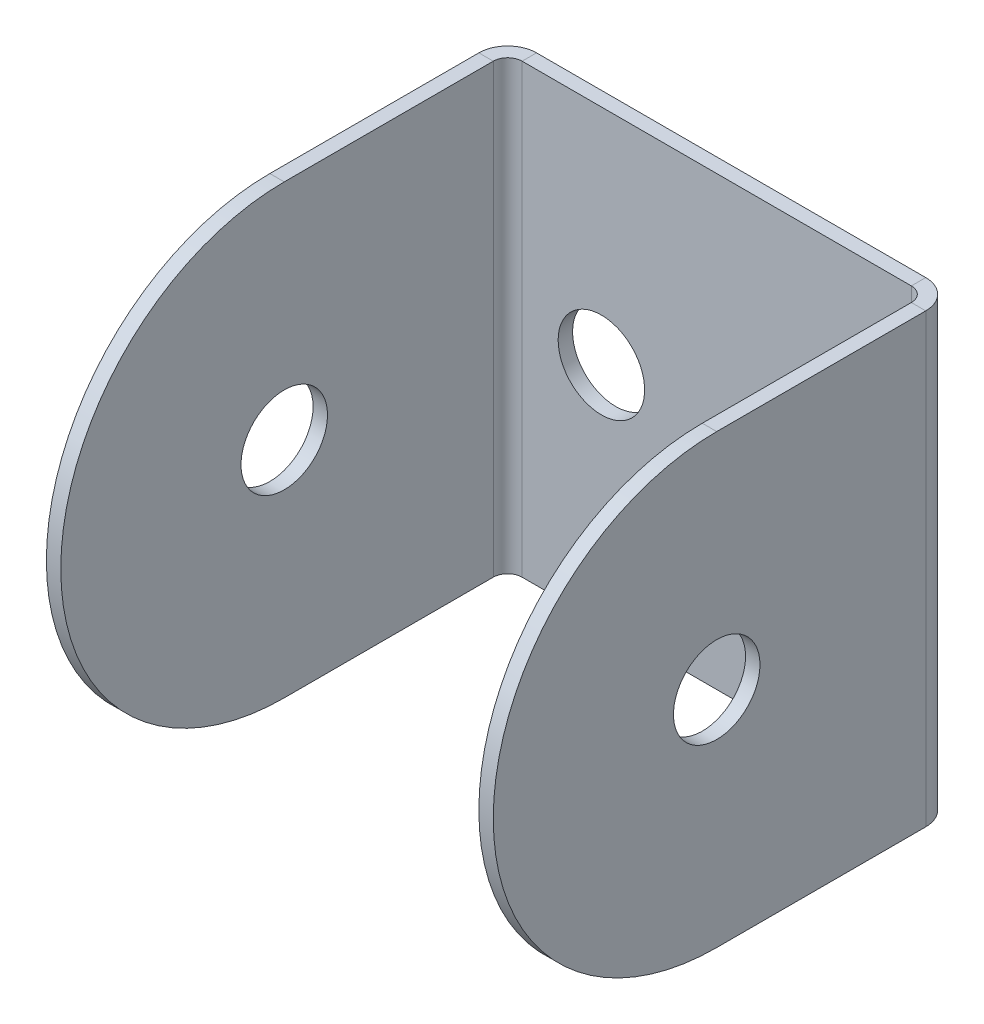
ISO-10303-21;
HEADER;
FILE_DESCRIPTION(('STEP AP214'),'2;1');
FILE_NAME('part.step','',(''),(''),'','','');
FILE_SCHEMA(('AUTOMOTIVE_DESIGN { 1 0 10303 214 1 1 1 1 }'));
ENDSEC;
DATA;
#1=APPLICATION_CONTEXT('core data for automotive mechanical design processes');
#2=APPLICATION_PROTOCOL_DEFINITION('international standard','automotive_design',2000,#1);
#3=PRODUCT_CONTEXT('',#1,'mechanical');
#4=PRODUCT('Part','Part','',(#3));
#5=PRODUCT_RELATED_PRODUCT_CATEGORY('part','',(#4));
#6=PRODUCT_DEFINITION_FORMATION('','',#4);
#7=PRODUCT_DEFINITION_CONTEXT('part definition',#1,'design');
#8=PRODUCT_DEFINITION('design','',#6,#7);
#9=PRODUCT_DEFINITION_SHAPE('','',#8);
#10=(LENGTH_UNIT() NAMED_UNIT(*) SI_UNIT(.MILLI.,.METRE.));
#11=(NAMED_UNIT(*) PLANE_ANGLE_UNIT() SI_UNIT($,.RADIAN.));
#12=(NAMED_UNIT(*) SI_UNIT($,.STERADIAN.) SOLID_ANGLE_UNIT());
#13=UNCERTAINTY_MEASURE_WITH_UNIT(LENGTH_MEASURE(1.E-05),#10,'distance_accuracy_value','');
#14=(GEOMETRIC_REPRESENTATION_CONTEXT(3) GLOBAL_UNCERTAINTY_ASSIGNED_CONTEXT((#13)) GLOBAL_UNIT_ASSIGNED_CONTEXT((#10,
#11,#12)) REPRESENTATION_CONTEXT('',''));
#15=CARTESIAN_POINT('',(0.,0.,0.));
#16=DIRECTION('',(0.,0.,1.));
#17=DIRECTION('',(1.,0.,0.));
#18=AXIS2_PLACEMENT_3D('',#15,#16,#17);
#19=CARTESIAN_POINT('',(-23.5068697123519,15.5,-18.6640439932318));
#20=DIRECTION('',(1.,0.,0.));
#21=DIRECTION('',(0.,0.,-1.));
#22=AXIS2_PLACEMENT_3D('',#19,#20,#21);
#23=PLANE('',#22);
#24=CARTESIAN_POINT('',(-23.5068697123519,7.75,-10.4140439932318));
#25=DIRECTION('',(1.,0.,0.));
#26=DIRECTION('',(0.,0.,-1.));
#27=AXIS2_PLACEMENT_3D('',#24,#25,#26);
#28=CIRCLE('',#27,1.5);
#29=CARTESIAN_POINT('',(-23.5068697123519,7.75,-11.9140439932318));
#30=VERTEX_POINT('',#29);
#31=EDGE_CURVE('E294',#30,#30,#28,.T.);
#32=ORIENTED_EDGE('',*,*,#31,.T.);
#33=EDGE_LOOP('',(#32));
#34=FACE_BOUND('',#33,.T.);
#35=DIRECTION('',(0.,0.,-1.));
#36=VECTOR('',#35,1.);
#37=CARTESIAN_POINT('',(-23.5068697123519,0.,-18.6640439932318));
#38=LINE('',#37,#36);
#39=CARTESIAN_POINT('',(-23.5068697123519,0.,-17.6640439932318));
#40=VERTEX_POINT('',#39);
#41=CARTESIAN_POINT('',(-23.5068697123519,0.,-10.4140439932318));
#42=VERTEX_POINT('',#41);
#43=EDGE_CURVE('E212',#40,#42,#38,.F.);
#44=ORIENTED_EDGE('',*,*,#43,.T.);
#45=CARTESIAN_POINT('',(-23.5068697123519,7.75,-10.4140439932318));
#46=DIRECTION('',(1.,0.,0.));
#47=DIRECTION('',(0.,0.,-1.));
#48=AXIS2_PLACEMENT_3D('',#45,#46,#47);
#49=CIRCLE('',#48,7.75);
#50=CARTESIAN_POINT('',(-23.5068697123519,15.5,-10.4140439932318));
#51=VERTEX_POINT('',#50);
#52=EDGE_CURVE('E291',#51,#42,#49,.T.);
#53=ORIENTED_EDGE('',*,*,#52,.F.);
#54=DIRECTION('',(0.,0.,-1.));
#55=VECTOR('',#54,1.);
#56=CARTESIAN_POINT('',(-23.5068697123519,15.5,-18.6640439932318));
#57=LINE('',#56,#55);
#58=CARTESIAN_POINT('',(-23.5068697123519,15.5,-17.6640439932318));
#59=VERTEX_POINT('',#58);
#60=EDGE_CURVE('E236',#59,#51,#57,.F.);
#61=ORIENTED_EDGE('',*,*,#60,.F.);
#62=DIRECTION('',(0.,-1.,0.));
#63=VECTOR('',#62,1.);
#64=CARTESIAN_POINT('',(-23.5068697123519,15.5,-17.6640439932318));
#65=LINE('',#64,#63);
#66=EDGE_CURVE('E208',#59,#40,#65,.T.);
#67=ORIENTED_EDGE('',*,*,#66,.T.);
#68=EDGE_LOOP('',(#44,#53,#61,#67));
#69=FACE_BOUND('',#68,.T.);
#70=ADVANCED_FACE('F88',(#34,#69),#23,.F.);
#71=CARTESIAN_POINT('',(-23.0068697123519,15.5,-18.6640439932318));
#72=DIRECTION('',(1.,0.,0.));
#73=DIRECTION('',(0.,0.,-1.));
#74=AXIS2_PLACEMENT_3D('',#71,#72,#73);
#75=PLANE('',#74);
#76=CARTESIAN_POINT('',(-23.0068697123519,7.75,-10.4140439932318));
#77=DIRECTION('',(1.,0.,0.));
#78=DIRECTION('',(0.,0.,-1.));
#79=AXIS2_PLACEMENT_3D('',#76,#77,#78);
#80=CIRCLE('',#79,1.5);
#81=CARTESIAN_POINT('',(-23.0068697123519,7.75,-11.9140439932318));
#82=VERTEX_POINT('',#81);
#83=EDGE_CURVE('E297',#82,#82,#80,.T.);
#84=ORIENTED_EDGE('',*,*,#83,.F.);
#85=EDGE_LOOP('',(#84));
#86=FACE_BOUND('',#85,.T.);
#87=CARTESIAN_POINT('',(-23.0068697123519,7.75,-10.4140439932318));
#88=DIRECTION('',(1.,0.,0.));
#89=DIRECTION('',(0.,0.,-1.));
#90=AXIS2_PLACEMENT_3D('',#87,#88,#89);
#91=CIRCLE('',#90,7.75);
#92=CARTESIAN_POINT('',(-23.0068697123519,15.5,-10.4140439932318));
#93=VERTEX_POINT('',#92);
#94=CARTESIAN_POINT('',(-23.0068697123519,0.,-10.4140439932318));
#95=VERTEX_POINT('',#94);
#96=EDGE_CURVE('E290',#93,#95,#91,.T.);
#97=ORIENTED_EDGE('',*,*,#96,.T.);
#98=DIRECTION('',(0.,0.,1.));
#99=VECTOR('',#98,1.);
#100=CARTESIAN_POINT('',(-23.0068697123519,0.,-18.6640439932318));
#101=LINE('',#100,#99);
#102=CARTESIAN_POINT('',(-23.0068697123519,0.,-17.6640439932318));
#103=VERTEX_POINT('',#102);
#104=EDGE_CURVE('E215',#103,#95,#101,.T.);
#105=ORIENTED_EDGE('',*,*,#104,.F.);
#106=DIRECTION('',(0.,-1.,0.));
#107=VECTOR('',#106,1.);
#108=CARTESIAN_POINT('',(-23.0068697123519,15.5,-17.6640439932318));
#109=LINE('',#108,#107);
#110=CARTESIAN_POINT('',(-23.0068697123519,15.5,-17.6640439932318));
#111=VERTEX_POINT('',#110);
#112=EDGE_CURVE('E250',#111,#103,#109,.T.);
#113=ORIENTED_EDGE('',*,*,#112,.F.);
#114=DIRECTION('',(0.,0.,1.));
#115=VECTOR('',#114,1.);
#116=CARTESIAN_POINT('',(-23.0068697123519,15.5,-18.6640439932318));
#117=LINE('',#116,#115);
#118=EDGE_CURVE('E284',#111,#93,#117,.T.);
#119=ORIENTED_EDGE('',*,*,#118,.T.);
#120=EDGE_LOOP('',(#97,#105,#113,#119));
#121=FACE_BOUND('',#120,.T.);
#122=ADVANCED_FACE('F361',(#86,#121),#75,.T.);
#123=CARTESIAN_POINT('',(-24.0068697123519,0.,-17.6640439932318));
#124=DIRECTION('',(0.,1.,0.));
#125=DIRECTION('',(1.,0.,0.));
#126=AXIS2_PLACEMENT_3D('',#123,#124,#125);
#127=PLANE('',#126);
#128=DIRECTION('',(-1.,0.,0.));
#129=VECTOR('',#128,1.);
#130=CARTESIAN_POINT('',(-23.5068697123519,0.,-10.4140439932318));
#131=LINE('',#130,#129);
#132=EDGE_CURVE('E317',#42,#95,#131,.F.);
#133=ORIENTED_EDGE('',*,*,#132,.F.);
#134=ORIENTED_EDGE('',*,*,#43,.F.);
#135=DIRECTION('',(1.,0.,0.));
#136=VECTOR('',#135,1.);
#137=CARTESIAN_POINT('',(-23.5068697123519,0.,-17.6640439932318));
#138=LINE('',#137,#136);
#139=EDGE_CURVE('E146',#40,#103,#138,.T.);
#140=ORIENTED_EDGE('',*,*,#139,.T.);
#141=ORIENTED_EDGE('',*,*,#104,.T.);
#142=EDGE_LOOP('',(#133,#134,#140,#141));
#143=FACE_BOUND('',#142,.T.);
#144=ADVANCED_FACE('F367',(#143),#127,.F.);
#145=CARTESIAN_POINT('',(-38.5068697123519,15.5,-18.6640439932318));
#146=DIRECTION('',(-1.,0.,0.));
#147=DIRECTION('',(0.,0.,1.));
#148=AXIS2_PLACEMENT_3D('',#145,#146,#147);
#149=PLANE('',#148);
#150=CARTESIAN_POINT('',(-38.5068697123519,7.75,-10.4140439932318));
#151=DIRECTION('',(1.,0.,0.));
#152=DIRECTION('',(0.,0.,-1.));
#153=AXIS2_PLACEMENT_3D('',#150,#151,#152);
#154=CIRCLE('',#153,1.5);
#155=CARTESIAN_POINT('',(-38.5068697123519,7.75,-11.9140439932318));
#156=VERTEX_POINT('',#155);
#157=EDGE_CURVE('E309',#156,#156,#154,.T.);
#158=ORIENTED_EDGE('',*,*,#157,.T.);
#159=EDGE_LOOP('',(#158));
#160=FACE_BOUND('',#159,.T.);
#161=CARTESIAN_POINT('',(-38.5068697123519,7.75,-10.4140439932318));
#162=DIRECTION('',(-1.,0.,0.));
#163=DIRECTION('',(0.,0.,1.));
#164=AXIS2_PLACEMENT_3D('',#161,#162,#163);
#165=CIRCLE('',#164,7.75);
#166=CARTESIAN_POINT('',(-38.5068697123519,0.,-10.4140439932318));
#167=VERTEX_POINT('',#166);
#168=CARTESIAN_POINT('',(-38.5068697123519,15.5,-10.4140439932318));
#169=VERTEX_POINT('',#168);
#170=EDGE_CURVE('E303',#167,#169,#165,.T.);
#171=ORIENTED_EDGE('',*,*,#170,.T.);
#172=DIRECTION('',(0.,0.,-1.));
#173=VECTOR('',#172,1.);
#174=CARTESIAN_POINT('',(-38.5068697123519,15.5,-18.6640439932318));
#175=LINE('',#174,#173);
#176=CARTESIAN_POINT('',(-38.5068697123519,15.5,-17.6640439932318));
#177=VERTEX_POINT('',#176);
#178=EDGE_CURVE('E269',#169,#177,#175,.T.);
#179=ORIENTED_EDGE('',*,*,#178,.T.);
#180=DIRECTION('',(0.,-1.,0.));
#181=VECTOR('',#180,1.);
#182=CARTESIAN_POINT('',(-38.5068697123519,15.5,-17.6640439932318));
#183=LINE('',#182,#181);
#184=CARTESIAN_POINT('',(-38.5068697123519,0.,-17.6640439932318));
#185=VERTEX_POINT('',#184);
#186=EDGE_CURVE('E241',#177,#185,#183,.T.);
#187=ORIENTED_EDGE('',*,*,#186,.T.);
#188=DIRECTION('',(0.,0.,-1.));
#189=VECTOR('',#188,1.);
#190=CARTESIAN_POINT('',(-38.5068697123519,0.,-18.6640439932318));
#191=LINE('',#190,#189);
#192=EDGE_CURVE('E227',#167,#185,#191,.T.);
#193=ORIENTED_EDGE('',*,*,#192,.F.);
#194=EDGE_LOOP('',(#171,#179,#187,#193));
#195=FACE_BOUND('',#194,.T.);
#196=ADVANCED_FACE('F416',(#160,#195),#149,.T.);
#197=CARTESIAN_POINT('',(-38.0068697123519,15.5,-18.6640439932318));
#198=DIRECTION('',(-1.,0.,0.));
#199=DIRECTION('',(0.,0.,1.));
#200=AXIS2_PLACEMENT_3D('',#197,#198,#199);
#201=PLANE('',#200);
#202=CARTESIAN_POINT('',(-38.0068697123519,7.75,-10.4140439932318));
#203=DIRECTION('',(1.,0.,0.));
#204=DIRECTION('',(0.,0.,-1.));
#205=AXIS2_PLACEMENT_3D('',#202,#203,#204);
#206=CIRCLE('',#205,1.5);
#207=CARTESIAN_POINT('',(-38.0068697123519,7.75,-11.9140439932318));
#208=VERTEX_POINT('',#207);
#209=EDGE_CURVE('E306',#208,#208,#206,.T.);
#210=ORIENTED_EDGE('',*,*,#209,.F.);
#211=EDGE_LOOP('',(#210));
#212=FACE_BOUND('',#211,.T.);
#213=DIRECTION('',(0.,0.,-1.));
#214=VECTOR('',#213,1.);
#215=CARTESIAN_POINT('',(-38.0068697123519,15.5,-18.6640439932318));
#216=LINE('',#215,#214);
#217=CARTESIAN_POINT('',(-38.0068697123519,15.5,-10.4140439932318));
#218=VERTEX_POINT('',#217);
#219=CARTESIAN_POINT('',(-38.0068697123519,15.5,-17.6640439932318));
#220=VERTEX_POINT('',#219);
#221=EDGE_CURVE('E189',#218,#220,#216,.T.);
#222=ORIENTED_EDGE('',*,*,#221,.F.);
#223=CARTESIAN_POINT('',(-38.0068697123519,7.75,-10.4140439932318));
#224=DIRECTION('',(-1.,0.,0.));
#225=DIRECTION('',(0.,0.,1.));
#226=AXIS2_PLACEMENT_3D('',#223,#224,#225);
#227=CIRCLE('',#226,7.75);
#228=CARTESIAN_POINT('',(-38.0068697123519,0.,-10.4140439932318));
#229=VERTEX_POINT('',#228);
#230=EDGE_CURVE('E304',#229,#218,#227,.T.);
#231=ORIENTED_EDGE('',*,*,#230,.F.);
#232=DIRECTION('',(0.,0.,-1.));
#233=VECTOR('',#232,1.);
#234=CARTESIAN_POINT('',(-38.0068697123519,0.,-18.6640439932318));
#235=LINE('',#234,#233);
#236=CARTESIAN_POINT('',(-38.0068697123519,0.,-17.6640439932318));
#237=VERTEX_POINT('',#236);
#238=EDGE_CURVE('E229',#229,#237,#235,.T.);
#239=ORIENTED_EDGE('',*,*,#238,.T.);
#240=DIRECTION('',(0.,-1.,0.));
#241=VECTOR('',#240,1.);
#242=CARTESIAN_POINT('',(-38.0068697123519,15.5,-17.6640439932318));
#243=LINE('',#242,#241);
#244=EDGE_CURVE('E200',#220,#237,#243,.T.);
#245=ORIENTED_EDGE('',*,*,#244,.F.);
#246=EDGE_LOOP('',(#222,#231,#239,#245));
#247=FACE_BOUND('',#246,.T.);
#248=ADVANCED_FACE('F391',(#212,#247),#201,.F.);
#249=CARTESIAN_POINT('',(-37.5068697123519,0.,-18.1640439932318));
#250=DIRECTION('',(0.,-1.,0.));
#251=DIRECTION('',(0.,0.,-1.));
#252=AXIS2_PLACEMENT_3D('',#249,#250,#251);
#253=PLANE('',#252);
#254=ORIENTED_EDGE('',*,*,#238,.F.);
#255=DIRECTION('',(1.,0.,0.));
#256=VECTOR('',#255,1.);
#257=CARTESIAN_POINT('',(-38.0068697123519,0.,-10.4140439932318));
#258=LINE('',#257,#256);
#259=EDGE_CURVE('E103',#229,#167,#258,.F.);
#260=ORIENTED_EDGE('',*,*,#259,.T.);
#261=ORIENTED_EDGE('',*,*,#192,.T.);
#262=DIRECTION('',(1.,0.,0.));
#263=VECTOR('',#262,1.);
#264=CARTESIAN_POINT('',(-38.5068697123519,0.,-17.6640439932318));
#265=LINE('',#264,#263);
#266=EDGE_CURVE('E261',#185,#237,#265,.T.);
#267=ORIENTED_EDGE('',*,*,#266,.T.);
#268=EDGE_LOOP('',(#254,#260,#261,#267));
#269=FACE_BOUND('',#268,.T.);
#270=ADVANCED_FACE('F385',(#269),#253,.T.);
#271=CARTESIAN_POINT('',(-24.0068697123519,15.5,-18.1640439932318));
#272=DIRECTION('',(0.,1.,0.));
#273=DIRECTION('',(0.,0.,1.));
#274=AXIS2_PLACEMENT_3D('',#271,#272,#273);
#275=PLANE('',#274);
#276=ORIENTED_EDGE('',*,*,#60,.T.);
#277=DIRECTION('',(-1.,0.,0.));
#278=VECTOR('',#277,1.);
#279=CARTESIAN_POINT('',(-23.5068697123519,15.5,-10.4140439932318));
#280=LINE('',#279,#278);
#281=EDGE_CURVE('E216',#51,#93,#280,.F.);
#282=ORIENTED_EDGE('',*,*,#281,.T.);
#283=ORIENTED_EDGE('',*,*,#118,.F.);
#284=DIRECTION('',(-1.,0.,0.));
#285=VECTOR('',#284,1.);
#286=CARTESIAN_POINT('',(-23.0068697123519,15.5,-17.6640439932318));
#287=LINE('',#286,#285);
#288=EDGE_CURVE('E112',#111,#59,#287,.T.);
#289=ORIENTED_EDGE('',*,*,#288,.T.);
#290=EDGE_LOOP('',(#276,#282,#283,#289));
#291=FACE_BOUND('',#290,.T.);
#292=ADVANCED_FACE('F382',(#291),#275,.T.);
#293=CARTESIAN_POINT('',(-37.5068697123519,15.5,-18.6640439932318));
#294=DIRECTION('',(0.,1.,0.));
#295=DIRECTION('',(0.,0.,1.));
#296=AXIS2_PLACEMENT_3D('',#293,#294,#295);
#297=PLANE('',#296);
#298=DIRECTION('',(0.,0.,1.));
#299=VECTOR('',#298,1.);
#300=CARTESIAN_POINT('',(-37.5068697123519,15.5,-18.6640439932318));
#301=LINE('',#300,#299);
#302=CARTESIAN_POINT('',(-37.5068697123519,15.5,-18.6640439932318));
#303=VERTEX_POINT('',#302);
#304=CARTESIAN_POINT('',(-37.5068697123519,15.5,-18.1640439932318));
#305=VERTEX_POINT('',#304);
#306=EDGE_CURVE('E14',#303,#305,#301,.T.);
#307=ORIENTED_EDGE('',*,*,#306,.F.);
#308=CARTESIAN_POINT('',(-37.5068697123519,15.5,-17.6640439932318));
#309=DIRECTION('',(0.,1.,0.));
#310=DIRECTION('',(0.,0.,1.));
#311=AXIS2_PLACEMENT_3D('',#308,#309,#310);
#312=CIRCLE('',#311,1.);
#313=EDGE_CURVE('E274',#177,#303,#312,.F.);
#314=ORIENTED_EDGE('',*,*,#313,.F.);
#315=DIRECTION('',(-1.,0.,0.));
#316=VECTOR('',#315,1.);
#317=CARTESIAN_POINT('',(-38.0068697123519,15.5,-17.6640439932318));
#318=LINE('',#317,#316);
#319=EDGE_CURVE('E96',#220,#177,#318,.T.);
#320=ORIENTED_EDGE('',*,*,#319,.F.);
#321=CARTESIAN_POINT('',(-37.5068697123519,15.5,-17.6640439932318));
#322=DIRECTION('',(0.,1.,0.));
#323=DIRECTION('',(1.,0.,0.));
#324=AXIS2_PLACEMENT_3D('',#321,#322,#323);
#325=CIRCLE('',#324,0.5);
#326=EDGE_CURVE('E183',#220,#305,#325,.F.);
#327=ORIENTED_EDGE('',*,*,#326,.T.);
#328=EDGE_LOOP('',(#307,#314,#320,#327));
#329=FACE_BOUND('',#328,.T.);
#330=ADVANCED_FACE('F90',(#329),#297,.T.);
#331=CARTESIAN_POINT('',(-38.0068697123519,15.5,-17.6640439932318));
#332=DIRECTION('',(0.,1.,0.));
#333=DIRECTION('',(0.,0.,1.));
#334=AXIS2_PLACEMENT_3D('',#331,#332,#333);
#335=PLANE('',#334);
#336=DIRECTION('',(1.,0.,0.));
#337=VECTOR('',#336,1.);
#338=CARTESIAN_POINT('',(-38.5068697123519,15.5,-18.6640439932318));
#339=LINE('',#338,#337);
#340=CARTESIAN_POINT('',(-24.0068697123519,15.5,-18.6640439932318));
#341=VERTEX_POINT('',#340);
#342=EDGE_CURVE('E176',#303,#341,#339,.T.);
#343=ORIENTED_EDGE('',*,*,#342,.F.);
#344=ORIENTED_EDGE('',*,*,#306,.T.);
#345=DIRECTION('',(1.,0.,0.));
#346=VECTOR('',#345,1.);
#347=CARTESIAN_POINT('',(-38.5068697123519,15.5,-18.1640439932318));
#348=LINE('',#347,#346);
#349=CARTESIAN_POINT('',(-24.0068697123519,15.5,-18.1640439932318));
#350=VERTEX_POINT('',#349);
#351=EDGE_CURVE('E173',#305,#350,#348,.T.);
#352=ORIENTED_EDGE('',*,*,#351,.T.);
#353=DIRECTION('',(0.,0.,-1.));
#354=VECTOR('',#353,1.);
#355=CARTESIAN_POINT('',(-24.0068697123519,15.5,-18.1640439932318));
#356=LINE('',#355,#354);
#357=EDGE_CURVE('E256',#350,#341,#356,.T.);
#358=ORIENTED_EDGE('',*,*,#357,.T.);
#359=EDGE_LOOP('',(#343,#344,#352,#358));
#360=FACE_BOUND('',#359,.T.);
#361=ADVANCED_FACE('F171',(#360),#335,.T.);
#362=CARTESIAN_POINT('',(-38.5068697123519,0.,-17.6640439932318));
#363=DIRECTION('',(0.,-1.,0.));
#364=DIRECTION('',(0.,0.,-1.));
#365=AXIS2_PLACEMENT_3D('',#362,#363,#364);
#366=PLANE('',#365);
#367=ORIENTED_EDGE('',*,*,#266,.F.);
#368=CARTESIAN_POINT('',(-37.5068697123519,0.,-17.6640439932318));
#369=DIRECTION('',(0.,1.,0.));
#370=DIRECTION('',(0.,0.,1.));
#371=AXIS2_PLACEMENT_3D('',#368,#369,#370);
#372=CIRCLE('',#371,1.);
#373=CARTESIAN_POINT('',(-37.5068697123519,0.,-18.6640439932318));
#374=VERTEX_POINT('',#373);
#375=EDGE_CURVE('E224',#185,#374,#372,.F.);
#376=ORIENTED_EDGE('',*,*,#375,.T.);
#377=DIRECTION('',(0.,0.,-1.));
#378=VECTOR('',#377,1.);
#379=CARTESIAN_POINT('',(-37.5068697123519,0.,-18.1640439932318));
#380=LINE('',#379,#378);
#381=CARTESIAN_POINT('',(-37.5068697123519,0.,-18.1640439932318));
#382=VERTEX_POINT('',#381);
#383=EDGE_CURVE('E259',#382,#374,#380,.T.);
#384=ORIENTED_EDGE('',*,*,#383,.F.);
#385=CARTESIAN_POINT('',(-37.5068697123519,0.,-17.6640439932318));
#386=DIRECTION('',(0.,1.,0.));
#387=DIRECTION('',(1.,0.,0.));
#388=AXIS2_PLACEMENT_3D('',#385,#386,#387);
#389=CIRCLE('',#388,0.5);
#390=EDGE_CURVE('E196',#237,#382,#389,.F.);
#391=ORIENTED_EDGE('',*,*,#390,.F.);
#392=EDGE_LOOP('',(#367,#376,#384,#391));
#393=FACE_BOUND('',#392,.T.);
#394=ADVANCED_FACE('F388',(#393),#366,.T.);
#395=CARTESIAN_POINT('',(-23.0068697123519,15.5,-17.6640439932318));
#396=DIRECTION('',(0.,1.,0.));
#397=DIRECTION('',(0.,0.,1.));
#398=AXIS2_PLACEMENT_3D('',#395,#396,#397);
#399=PLANE('',#398);
#400=ORIENTED_EDGE('',*,*,#288,.F.);
#401=CARTESIAN_POINT('',(-24.0068697123519,15.5,-17.6640439932318));
#402=DIRECTION('',(0.,1.,0.));
#403=DIRECTION('',(0.,0.,1.));
#404=AXIS2_PLACEMENT_3D('',#401,#402,#403);
#405=CIRCLE('',#404,1.);
#406=EDGE_CURVE('E279',#341,#111,#405,.F.);
#407=ORIENTED_EDGE('',*,*,#406,.F.);
#408=ORIENTED_EDGE('',*,*,#357,.F.);
#409=CARTESIAN_POINT('',(-24.0068697123519,15.5,-17.6640439932318));
#410=DIRECTION('',(0.,1.,0.));
#411=DIRECTION('',(1.,0.,0.));
#412=AXIS2_PLACEMENT_3D('',#409,#410,#411);
#413=CIRCLE('',#412,0.5);
#414=EDGE_CURVE('E206',#350,#59,#413,.F.);
#415=ORIENTED_EDGE('',*,*,#414,.T.);
#416=EDGE_LOOP('',(#400,#407,#408,#415));
#417=FACE_BOUND('',#416,.T.);
#418=ADVANCED_FACE('F381',(#417),#399,.T.);
#419=CARTESIAN_POINT('',(-24.0068697123519,0.,-18.6640439932318));
#420=DIRECTION('',(0.,-1.,0.));
#421=DIRECTION('',(0.,0.,-1.));
#422=AXIS2_PLACEMENT_3D('',#419,#420,#421);
#423=PLANE('',#422);
#424=DIRECTION('',(0.,0.,1.));
#425=VECTOR('',#424,1.);
#426=CARTESIAN_POINT('',(-24.0068697123519,0.,-18.6640439932318));
#427=LINE('',#426,#425);
#428=CARTESIAN_POINT('',(-24.0068697123519,0.,-18.6640439932318));
#429=VERTEX_POINT('',#428);
#430=CARTESIAN_POINT('',(-24.0068697123519,0.,-18.1640439932318));
#431=VERTEX_POINT('',#430);
#432=EDGE_CURVE('E254',#429,#431,#427,.T.);
#433=ORIENTED_EDGE('',*,*,#432,.F.);
#434=CARTESIAN_POINT('',(-24.0068697123519,0.,-17.6640439932318));
#435=DIRECTION('',(0.,1.,0.));
#436=DIRECTION('',(0.,0.,1.));
#437=AXIS2_PLACEMENT_3D('',#434,#435,#436);
#438=CIRCLE('',#437,1.);
#439=EDGE_CURVE('E219',#429,#103,#438,.F.);
#440=ORIENTED_EDGE('',*,*,#439,.T.);
#441=ORIENTED_EDGE('',*,*,#139,.F.);
#442=CARTESIAN_POINT('',(-24.0068697123519,0.,-17.6640439932318));
#443=DIRECTION('',(0.,1.,0.));
#444=DIRECTION('',(1.,0.,0.));
#445=AXIS2_PLACEMENT_3D('',#442,#443,#444);
#446=CIRCLE('',#445,0.5);
#447=EDGE_CURVE('E234',#431,#40,#446,.F.);
#448=ORIENTED_EDGE('',*,*,#447,.F.);
#449=EDGE_LOOP('',(#433,#440,#441,#448));
#450=FACE_BOUND('',#449,.T.);
#451=ADVANCED_FACE('F377',(#450),#423,.T.);
#452=CARTESIAN_POINT('',(-23.5068697123519,0.,-17.6640439932318));
#453=DIRECTION('',(0.,-1.,0.));
#454=DIRECTION('',(0.,0.,-1.));
#455=AXIS2_PLACEMENT_3D('',#452,#453,#454);
#456=PLANE('',#455);
#457=DIRECTION('',(1.,0.,0.));
#458=VECTOR('',#457,1.);
#459=CARTESIAN_POINT('',(-38.5068697123519,0.,-18.6640439932318));
#460=LINE('',#459,#458);
#461=EDGE_CURVE('E221',#374,#429,#460,.T.);
#462=ORIENTED_EDGE('',*,*,#461,.T.);
#463=ORIENTED_EDGE('',*,*,#432,.T.);
#464=DIRECTION('',(1.,0.,0.));
#465=VECTOR('',#464,1.);
#466=CARTESIAN_POINT('',(-38.5068697123519,0.,-18.1640439932318));
#467=LINE('',#466,#465);
#468=EDGE_CURVE('E232',#382,#431,#467,.T.);
#469=ORIENTED_EDGE('',*,*,#468,.F.);
#470=ORIENTED_EDGE('',*,*,#383,.T.);
#471=EDGE_LOOP('',(#462,#463,#469,#470));
#472=FACE_BOUND('',#471,.T.);
#473=ADVANCED_FACE('F373',(#472),#456,.T.);
#474=CARTESIAN_POINT('',(-24.0068697123519,15.5,-17.6640439932318));
#475=DIRECTION('',(0.,-1.,0.));
#476=DIRECTION('',(0.,0.,-1.));
#477=AXIS2_PLACEMENT_3D('',#474,#475,#476);
#478=CYLINDRICAL_SURFACE('',#477,1.);
#479=ORIENTED_EDGE('',*,*,#439,.F.);
#480=DIRECTION('',(0.,-1.,0.));
#481=VECTOR('',#480,1.);
#482=CARTESIAN_POINT('',(-24.0068697123519,15.5,-18.6640439932318));
#483=LINE('',#482,#481);
#484=EDGE_CURVE('E247',#341,#429,#483,.T.);
#485=ORIENTED_EDGE('',*,*,#484,.F.);
#486=ORIENTED_EDGE('',*,*,#406,.T.);
#487=ORIENTED_EDGE('',*,*,#112,.T.);
#488=EDGE_LOOP('',(#479,#485,#486,#487));
#489=FACE_BOUND('',#488,.T.);
#490=ADVANCED_FACE('F376',(#489),#478,.T.);
#491=CARTESIAN_POINT('',(-38.5068697123519,15.5,-18.6640439932318));
#492=DIRECTION('',(0.,0.,-1.));
#493=DIRECTION('',(-1.,0.,0.));
#494=AXIS2_PLACEMENT_3D('',#491,#492,#493);
#495=PLANE('',#494);
#496=CARTESIAN_POINT('',(-34.7568697123519,7.75,-18.6640439932318));
#497=DIRECTION('',(0.,0.,1.));
#498=DIRECTION('',(-1.,0.,0.));
#499=AXIS2_PLACEMENT_3D('',#496,#497,#498);
#500=CIRCLE('',#499,1.5);
#501=CARTESIAN_POINT('',(-36.2568697123519,7.75,-18.6640439932318));
#502=VERTEX_POINT('',#501);
#503=EDGE_CURVE('E324',#502,#502,#500,.T.);
#504=ORIENTED_EDGE('',*,*,#503,.T.);
#505=EDGE_LOOP('',(#504));
#506=FACE_BOUND('',#505,.T.);
#507=CARTESIAN_POINT('',(-26.7568697123519,7.75,-18.6640439932318));
#508=DIRECTION('',(0.,0.,1.));
#509=DIRECTION('',(1.,0.,0.));
#510=AXIS2_PLACEMENT_3D('',#507,#508,#509);
#511=CIRCLE('',#510,1.5);
#512=CARTESIAN_POINT('',(-25.2568697123519,7.75,-18.6640439932318));
#513=VERTEX_POINT('',#512);
#514=EDGE_CURVE('E320',#513,#513,#511,.T.);
#515=ORIENTED_EDGE('',*,*,#514,.T.);
#516=EDGE_LOOP('',(#515));
#517=FACE_BOUND('',#516,.T.);
#518=ORIENTED_EDGE('',*,*,#461,.F.);
#519=DIRECTION('',(0.,-1.,0.));
#520=VECTOR('',#519,1.);
#521=CARTESIAN_POINT('',(-37.5068697123519,15.5,-18.6640439932318));
#522=LINE('',#521,#520);
#523=EDGE_CURVE('E244',#303,#374,#522,.T.);
#524=ORIENTED_EDGE('',*,*,#523,.F.);
#525=ORIENTED_EDGE('',*,*,#342,.T.);
#526=ORIENTED_EDGE('',*,*,#484,.T.);
#527=EDGE_LOOP('',(#518,#524,#525,#526));
#528=FACE_BOUND('',#527,.T.);
#529=ADVANCED_FACE('F333',(#506,#517,#528),#495,.T.);
#530=CARTESIAN_POINT('',(-37.5068697123519,15.5,-17.6640439932318));
#531=DIRECTION('',(0.,-1.,0.));
#532=DIRECTION('',(0.,0.,-1.));
#533=AXIS2_PLACEMENT_3D('',#530,#531,#532);
#534=CYLINDRICAL_SURFACE('',#533,1.);
#535=ORIENTED_EDGE('',*,*,#375,.F.);
#536=ORIENTED_EDGE('',*,*,#186,.F.);
#537=ORIENTED_EDGE('',*,*,#313,.T.);
#538=ORIENTED_EDGE('',*,*,#523,.T.);
#539=EDGE_LOOP('',(#535,#536,#537,#538));
#540=FACE_BOUND('',#539,.T.);
#541=ADVANCED_FACE('F273',(#540),#534,.T.);
#542=CARTESIAN_POINT('',(-37.5068697123519,15.5,-17.6640439932318));
#543=DIRECTION('',(0.,-1.,0.));
#544=DIRECTION('',(0.,0.,-1.));
#545=AXIS2_PLACEMENT_3D('',#542,#543,#544);
#546=CYLINDRICAL_SURFACE('',#545,0.5);
#547=ORIENTED_EDGE('',*,*,#390,.T.);
#548=DIRECTION('',(0.,-1.,0.));
#549=VECTOR('',#548,1.);
#550=CARTESIAN_POINT('',(-37.5068697123519,15.5,-18.1640439932318));
#551=LINE('',#550,#549);
#552=EDGE_CURVE('E193',#305,#382,#551,.T.);
#553=ORIENTED_EDGE('',*,*,#552,.F.);
#554=ORIENTED_EDGE('',*,*,#326,.F.);
#555=ORIENTED_EDGE('',*,*,#244,.T.);
#556=EDGE_LOOP('',(#547,#553,#554,#555));
#557=FACE_BOUND('',#556,.T.);
#558=ADVANCED_FACE('F194',(#557),#546,.F.);
#559=CARTESIAN_POINT('',(-38.5068697123519,15.5,-18.1640439932318));
#560=DIRECTION('',(0.,0.,-1.));
#561=DIRECTION('',(-1.,0.,0.));
#562=AXIS2_PLACEMENT_3D('',#559,#560,#561);
#563=PLANE('',#562);
#564=CARTESIAN_POINT('',(-34.7568697123519,7.75,-18.1640439932318));
#565=DIRECTION('',(0.,0.,1.));
#566=DIRECTION('',(-1.,0.,0.));
#567=AXIS2_PLACEMENT_3D('',#564,#565,#566);
#568=CIRCLE('',#567,1.5);
#569=CARTESIAN_POINT('',(-36.2568697123519,7.75,-18.1640439932318));
#570=VERTEX_POINT('',#569);
#571=EDGE_CURVE('E327',#570,#570,#568,.T.);
#572=ORIENTED_EDGE('',*,*,#571,.F.);
#573=EDGE_LOOP('',(#572));
#574=FACE_BOUND('',#573,.T.);
#575=CARTESIAN_POINT('',(-26.7568697123519,7.75,-18.1640439932318));
#576=DIRECTION('',(0.,0.,1.));
#577=DIRECTION('',(1.,0.,0.));
#578=AXIS2_PLACEMENT_3D('',#575,#576,#577);
#579=CIRCLE('',#578,1.5);
#580=CARTESIAN_POINT('',(-25.2568697123519,7.75,-18.1640439932318));
#581=VERTEX_POINT('',#580);
#582=EDGE_CURVE('E321',#581,#581,#579,.T.);
#583=ORIENTED_EDGE('',*,*,#582,.F.);
#584=EDGE_LOOP('',(#583));
#585=FACE_BOUND('',#584,.T.);
#586=ORIENTED_EDGE('',*,*,#468,.T.);
#587=DIRECTION('',(0.,-1.,0.));
#588=VECTOR('',#587,1.);
#589=CARTESIAN_POINT('',(-24.0068697123519,15.5,-18.1640439932318));
#590=LINE('',#589,#588);
#591=EDGE_CURVE('E201',#350,#431,#590,.T.);
#592=ORIENTED_EDGE('',*,*,#591,.F.);
#593=ORIENTED_EDGE('',*,*,#351,.F.);
#594=ORIENTED_EDGE('',*,*,#552,.T.);
#595=EDGE_LOOP('',(#586,#592,#593,#594));
#596=FACE_BOUND('',#595,.T.);
#597=ADVANCED_FACE('F203',(#574,#585,#596),#563,.F.);
#598=CARTESIAN_POINT('',(-24.0068697123519,15.5,-17.6640439932318));
#599=DIRECTION('',(0.,-1.,0.));
#600=DIRECTION('',(0.,0.,-1.));
#601=AXIS2_PLACEMENT_3D('',#598,#599,#600);
#602=CYLINDRICAL_SURFACE('',#601,0.5);
#603=ORIENTED_EDGE('',*,*,#447,.T.);
#604=ORIENTED_EDGE('',*,*,#66,.F.);
#605=ORIENTED_EDGE('',*,*,#414,.F.);
#606=ORIENTED_EDGE('',*,*,#591,.T.);
#607=EDGE_LOOP('',(#603,#604,#605,#606));
#608=FACE_BOUND('',#607,.T.);
#609=ADVANCED_FACE('F345',(#608),#602,.F.);
#610=CARTESIAN_POINT('',(-24.0068697123519,15.5,-17.6640439932318));
#611=DIRECTION('',(0.,1.,0.));
#612=DIRECTION('',(1.,0.,0.));
#613=AXIS2_PLACEMENT_3D('',#610,#611,#612);
#614=PLANE('',#613);
#615=DIRECTION('',(1.,0.,0.));
#616=VECTOR('',#615,1.);
#617=CARTESIAN_POINT('',(-38.0068697123519,15.5,-10.4140439932318));
#618=LINE('',#617,#616);
#619=EDGE_CURVE('E312',#218,#169,#618,.F.);
#620=ORIENTED_EDGE('',*,*,#619,.F.);
#621=ORIENTED_EDGE('',*,*,#221,.T.);
#622=ORIENTED_EDGE('',*,*,#319,.T.);
#623=ORIENTED_EDGE('',*,*,#178,.F.);
#624=EDGE_LOOP('',(#620,#621,#622,#623));
#625=FACE_BOUND('',#624,.T.);
#626=ADVANCED_FACE('F267',(#625),#614,.T.);
#627=CARTESIAN_POINT('',(-23.5068697123519,7.75,-10.4140439932318));
#628=DIRECTION('',(1.,0.,0.));
#629=DIRECTION('',(0.,0.,-1.));
#630=AXIS2_PLACEMENT_3D('',#627,#628,#629);
#631=CYLINDRICAL_SURFACE('',#630,7.75);
#632=ORIENTED_EDGE('',*,*,#52,.T.);
#633=ORIENTED_EDGE('',*,*,#132,.T.);
#634=ORIENTED_EDGE('',*,*,#96,.F.);
#635=ORIENTED_EDGE('',*,*,#281,.F.);
#636=EDGE_LOOP('',(#632,#633,#634,#635));
#637=FACE_BOUND('',#636,.T.);
#638=ADVANCED_FACE('F551',(#637),#631,.T.);
#639=CARTESIAN_POINT('',(-23.0068697123519,7.75,-10.4140439932318));
#640=DIRECTION('',(1.,0.,0.));
#641=DIRECTION('',(0.,0.,-1.));
#642=AXIS2_PLACEMENT_3D('',#639,#640,#641);
#643=CYLINDRICAL_SURFACE('',#642,1.5);
#644=ORIENTED_EDGE('',*,*,#31,.F.);
#645=EDGE_LOOP('',(#644));
#646=FACE_BOUND('',#645,.T.);
#647=ORIENTED_EDGE('',*,*,#83,.T.);
#648=EDGE_LOOP('',(#647));
#649=FACE_BOUND('',#648,.T.);
#650=ADVANCED_FACE('F556',(#646,#649),#643,.F.);
#651=CARTESIAN_POINT('',(-38.0068697123519,7.75,-10.4140439932318));
#652=DIRECTION('',(-1.,0.,0.));
#653=DIRECTION('',(0.,0.,1.));
#654=AXIS2_PLACEMENT_3D('',#651,#652,#653);
#655=CYLINDRICAL_SURFACE('',#654,7.75);
#656=ORIENTED_EDGE('',*,*,#230,.T.);
#657=ORIENTED_EDGE('',*,*,#619,.T.);
#658=ORIENTED_EDGE('',*,*,#170,.F.);
#659=ORIENTED_EDGE('',*,*,#259,.F.);
#660=EDGE_LOOP('',(#656,#657,#658,#659));
#661=FACE_BOUND('',#660,.T.);
#662=ADVANCED_FACE('F356',(#661),#655,.T.);
#663=CARTESIAN_POINT('',(-38.5068697123519,7.75,-10.4140439932318));
#664=DIRECTION('',(1.,0.,0.));
#665=DIRECTION('',(0.,0.,-1.));
#666=AXIS2_PLACEMENT_3D('',#663,#664,#665);
#667=CYLINDRICAL_SURFACE('',#666,1.5);
#668=ORIENTED_EDGE('',*,*,#209,.T.);
#669=EDGE_LOOP('',(#668));
#670=FACE_BOUND('',#669,.T.);
#671=ORIENTED_EDGE('',*,*,#157,.F.);
#672=EDGE_LOOP('',(#671));
#673=FACE_BOUND('',#672,.T.);
#674=ADVANCED_FACE('F350',(#670,#673),#667,.F.);
#675=CARTESIAN_POINT('',(-26.7568697123519,7.75,-18.6640439932318));
#676=DIRECTION('',(0.,0.,1.));
#677=DIRECTION('',(1.,0.,0.));
#678=AXIS2_PLACEMENT_3D('',#675,#676,#677);
#679=CYLINDRICAL_SURFACE('',#678,1.5);
#680=ORIENTED_EDGE('',*,*,#514,.F.);
#681=EDGE_LOOP('',(#680));
#682=FACE_BOUND('',#681,.T.);
#683=ORIENTED_EDGE('',*,*,#582,.T.);
#684=EDGE_LOOP('',(#683));
#685=FACE_BOUND('',#684,.T.);
#686=ADVANCED_FACE('F339',(#682,#685),#679,.F.);
#687=CARTESIAN_POINT('',(-34.7568697123519,7.75,-18.6640439932318));
#688=DIRECTION('',(0.,0.,1.));
#689=DIRECTION('',(1.,0.,0.));
#690=AXIS2_PLACEMENT_3D('',#687,#688,#689);
#691=CYLINDRICAL_SURFACE('',#690,1.5);
#692=ORIENTED_EDGE('',*,*,#503,.F.);
#693=EDGE_LOOP('',(#692));
#694=FACE_BOUND('',#693,.T.);
#695=ORIENTED_EDGE('',*,*,#571,.T.);
#696=EDGE_LOOP('',(#695));
#697=FACE_BOUND('',#696,.T.);
#698=ADVANCED_FACE('F336',(#694,#697),#691,.F.);
#699=CLOSED_SHELL('',(#70,#122,#144,#196,#248,#270,#292,#330,#361,#394,#418,#451,#473,#490,#529,
#541,#558,#597,#609,#626,#638,#650,#662,#674,#686,#698));
#700=MANIFOLD_SOLID_BREP('B2',#699);
#701=ADVANCED_BREP_SHAPE_REPRESENTATION('',(#18,#700),#14);
#702=SHAPE_DEFINITION_REPRESENTATION(#9,#701);
ENDSEC;
END-ISO-10303-21;
